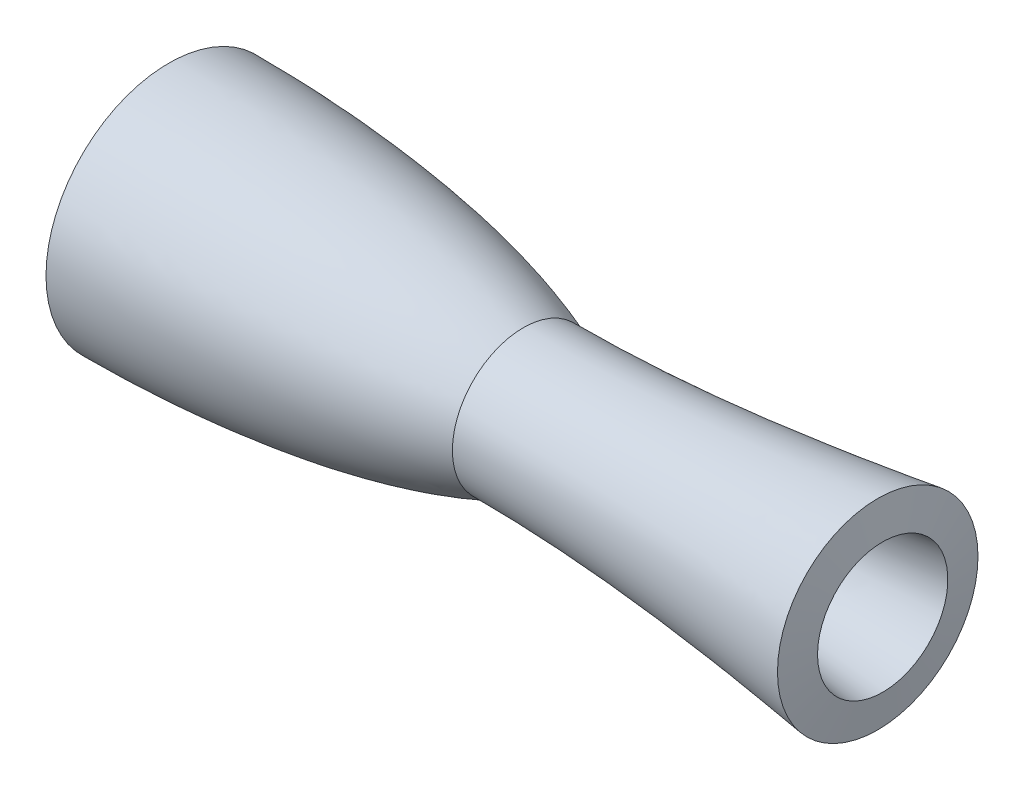
ISO-10303-21;
HEADER;
FILE_DESCRIPTION(('STEP AP214'),'2;1');
FILE_NAME('part.step','',(''),(''),'','','');
FILE_SCHEMA(('AUTOMOTIVE_DESIGN { 1 0 10303 214 1 1 1 1 }'));
ENDSEC;
DATA;
#1=APPLICATION_CONTEXT('core data for automotive mechanical design processes');
#2=APPLICATION_PROTOCOL_DEFINITION('international standard','automotive_design',2000,#1);
#3=PRODUCT_CONTEXT('',#1,'mechanical');
#4=PRODUCT('Part','Part','',(#3));
#5=PRODUCT_RELATED_PRODUCT_CATEGORY('part','',(#4));
#6=PRODUCT_DEFINITION_FORMATION('','',#4);
#7=PRODUCT_DEFINITION_CONTEXT('part definition',#1,'design');
#8=PRODUCT_DEFINITION('design','',#6,#7);
#9=PRODUCT_DEFINITION_SHAPE('','',#8);
#10=(LENGTH_UNIT() NAMED_UNIT(*) SI_UNIT(.MILLI.,.METRE.));
#11=(NAMED_UNIT(*) PLANE_ANGLE_UNIT() SI_UNIT($,.RADIAN.));
#12=(NAMED_UNIT(*) SI_UNIT($,.STERADIAN.) SOLID_ANGLE_UNIT());
#13=UNCERTAINTY_MEASURE_WITH_UNIT(LENGTH_MEASURE(1.E-05),#10,'distance_accuracy_value','');
#14=(GEOMETRIC_REPRESENTATION_CONTEXT(3) GLOBAL_UNCERTAINTY_ASSIGNED_CONTEXT((#13)) GLOBAL_UNIT_ASSIGNED_CONTEXT((#10,
#11,#12)) REPRESENTATION_CONTEXT('',''));
#15=CARTESIAN_POINT('',(0.,0.,0.));
#16=DIRECTION('',(0.,0.,1.));
#17=DIRECTION('',(1.,0.,0.));
#18=AXIS2_PLACEMENT_3D('',#15,#16,#17);
#19=CARTESIAN_POINT('',(98.1549156141227,10.0019360312742,0.));
#20=CARTESIAN_POINT('',(98.687683163248,10.0013754041496,0.));
#21=CARTESIAN_POINT('',(99.2204507119923,10.0008147770255,0.));
#22=CARTESIAN_POINT('',(99.8864101487289,10.0001139931194,0.));
#23=CARTESIAN_POINT('',(100.020260601693,9.99995440538415,0.));
#24=CARTESIAN_POINT('',(100.292445694937,9.99976487695716,0.));
#25=CARTESIAN_POINT('',(100.700708342601,9.9996582834871,0.));
#26=CARTESIAN_POINT('',(102.197505712254,10.0012163933069,0.));
#27=CARTESIAN_POINT('',(105.734073160988,10.0201641607239,0.));
#28=CARTESIAN_POINT('',(113.344241468291,10.1380145877795,0.));
#29=CARTESIAN_POINT('',(119.854324986982,10.3646977299021,0.));
#30=CARTESIAN_POINT('',(132.855166758294,10.9686392967534,0.));
#31=CARTESIAN_POINT('',(141.496612171352,11.5719999766859,0.));
#32=CARTESIAN_POINT('',(167.327696020727,13.8496162288429,0.));
#33=CARTESIAN_POINT('',(184.418775947122,15.9907192937739,0.));
#34=CARTESIAN_POINT('',(201.394709537506,18.38173837419,0.));
#35=B_SPLINE_CURVE_WITH_KNOTS('',3,(#19,#20,#21,#22,#23,#24,#25,#26,#27,#28,#29,#30,#31,#32,#33,
#34),.UNSPECIFIED.,.F.,.F.,(4,2,2,1,1,1,1,2,2,4),(0.,0.0156249999999993,0.0195312499999992,
0.0234374999999991,0.0312499999999993,0.0624999999999991,0.124999999999999,0.249999999999999,
0.499999999999999,1.),.UNSPECIFIED.);
#36=CARTESIAN_POINT('',(0.,0.,0.));
#37=DIRECTION('',(-1.,0.,0.));
#38=AXIS1_PLACEMENT('',#36,#37);
#39=SURFACE_OF_REVOLUTION('',#35,#38);
#40=CARTESIAN_POINT('',(201.394709537506,0.,0.));
#41=DIRECTION('',(-1.,0.,0.));
#42=DIRECTION('',(0.,0.,1.));
#43=AXIS2_PLACEMENT_3D('',#40,#41,#42);
#44=CIRCLE('',#43,18.38173837419);
#45=CARTESIAN_POINT('',(201.394709537506,0.,18.38173837419));
#46=VERTEX_POINT('',#45);
#47=EDGE_CURVE('E12',#46,#46,#44,.T.);
#48=ORIENTED_EDGE('',*,*,#47,.F.);
#49=EDGE_LOOP('',(#48));
#50=FACE_BOUND('',#49,.T.);
#51=CARTESIAN_POINT('',(98.1549156141227,0.,0.));
#52=DIRECTION('',(-1.,0.,0.));
#53=DIRECTION('',(0.,0.,1.));
#54=AXIS2_PLACEMENT_3D('',#51,#52,#53);
#55=CIRCLE('',#54,10.0019360312742);
#56=CARTESIAN_POINT('',(98.1549156141227,0.,10.0019360312742));
#57=VERTEX_POINT('',#56);
#58=EDGE_CURVE('E83',#57,#57,#55,.T.);
#59=ORIENTED_EDGE('',*,*,#58,.T.);
#60=EDGE_LOOP('',(#59));
#61=FACE_BOUND('',#60,.T.);
#62=ADVANCED_FACE('F52',(#50,#61),#39,.T.);
#63=CARTESIAN_POINT('',(200.,0.,0.));
#64=DIRECTION('',(-1.,0.,0.));
#65=DIRECTION('',(0.,0.,1.));
#66=AXIS2_PLACEMENT_3D('',#63,#64,#65);
#67=CONICAL_SURFACE('',#66,28.284,1.43086920031281);
#68=ORIENTED_EDGE('',*,*,#47,.T.);
#69=EDGE_LOOP('',(#68));
#70=FACE_BOUND('',#69,.T.);
#71=CARTESIAN_POINT('',(200.,0.,0.));
#72=DIRECTION('',(-1.,0.,0.));
#73=DIRECTION('',(0.,0.,1.));
#74=AXIS2_PLACEMENT_3D('',#71,#72,#73);
#75=CIRCLE('',#74,28.284);
#76=CARTESIAN_POINT('',(200.,0.,28.284));
#77=VERTEX_POINT('',#76);
#78=EDGE_CURVE('E61',#77,#77,#75,.T.);
#79=ORIENTED_EDGE('',*,*,#78,.F.);
#80=EDGE_LOOP('',(#79));
#81=FACE_BOUND('',#80,.T.);
#82=ADVANCED_FACE('F112',(#70,#81),#67,.T.);
#83=CARTESIAN_POINT('',(100.,20.,0.));
#84=CARTESIAN_POINT('',(116.695242117816,19.9824317273114,0.));
#85=CARTESIAN_POINT('',(150.151112464226,21.7760524174535,0.));
#86=CARTESIAN_POINT('',(183.381389053337,25.9433089474625,0.));
#87=CARTESIAN_POINT('',(200.,28.284,0.));
#88=B_SPLINE_CURVE_WITH_KNOTS('',3,(#83,#84,#85,#86,#87),.UNSPECIFIED.,.F.,.F.,(4,1,4),(0.,
0.498579711466599,1.),.UNSPECIFIED.);
#89=CARTESIAN_POINT('',(0.,0.,0.));
#90=DIRECTION('',(-1.,0.,0.));
#91=AXIS1_PLACEMENT('',#89,#90);
#92=SURFACE_OF_REVOLUTION('',#88,#91);
#93=ORIENTED_EDGE('',*,*,#78,.T.);
#94=EDGE_LOOP('',(#93));
#95=FACE_BOUND('',#94,.T.);
#96=CARTESIAN_POINT('',(100.,0.,0.));
#97=DIRECTION('',(-1.,0.,0.));
#98=DIRECTION('',(0.,0.,1.));
#99=AXIS2_PLACEMENT_3D('',#96,#97,#98);
#100=CIRCLE('',#99,20.);
#101=CARTESIAN_POINT('',(100.,0.,20.));
#102=VERTEX_POINT('',#101);
#103=EDGE_CURVE('E67',#102,#102,#100,.T.);
#104=ORIENTED_EDGE('',*,*,#103,.F.);
#105=EDGE_LOOP('',(#104));
#106=FACE_BOUND('',#105,.T.);
#107=ADVANCED_FACE('F109',(#95,#106),#92,.F.);
#108=CARTESIAN_POINT('',(0.,34.641,0.));
#109=CARTESIAN_POINT('',(16.7095869276814,34.6307944400639,0.));
#110=CARTESIAN_POINT('',(50.5578662107212,32.7566782697457,0.));
#111=CARTESIAN_POINT('',(83.9080542511355,26.129356883055,0.));
#112=CARTESIAN_POINT('',(100.,20.,0.));
#113=B_SPLINE_CURVE_WITH_KNOTS('',3,(#108,#109,#110,#111,#112),.UNSPECIFIED.,.F.,.F.,(4,1,4),
(0.,0.493551598633809,1.),.UNSPECIFIED.);
#114=CARTESIAN_POINT('',(0.,0.,0.));
#115=DIRECTION('',(-1.,0.,0.));
#116=AXIS1_PLACEMENT('',#114,#115);
#117=SURFACE_OF_REVOLUTION('',#113,#116);
#118=ORIENTED_EDGE('',*,*,#103,.T.);
#119=EDGE_LOOP('',(#118));
#120=FACE_BOUND('',#119,.T.);
#121=CARTESIAN_POINT('',(0.,0.,0.));
#122=DIRECTION('',(-1.,0.,0.));
#123=DIRECTION('',(0.,0.,1.));
#124=AXIS2_PLACEMENT_3D('',#121,#122,#123);
#125=CIRCLE('',#124,34.641);
#126=CARTESIAN_POINT('',(0.,0.,34.641));
#127=VERTEX_POINT('',#126);
#128=EDGE_CURVE('E71',#127,#127,#125,.T.);
#129=ORIENTED_EDGE('',*,*,#128,.F.);
#130=EDGE_LOOP('',(#129));
#131=FACE_BOUND('',#130,.T.);
#132=ADVANCED_FACE('F101',(#120,#131),#117,.F.);
#133=CARTESIAN_POINT('',(-0.0061076064158715,0.,0.));
#134=DIRECTION('',(1.,0.,0.));
#135=DIRECTION('',(0.,0.,-1.));
#136=AXIS2_PLACEMENT_3D('',#133,#134,#135);
#137=CONICAL_SURFACE('',#136,24.641001865143,1.57018556611534);
#138=ORIENTED_EDGE('',*,*,#128,.T.);
#139=EDGE_LOOP('',(#138));
#140=FACE_BOUND('',#139,.T.);
#141=CARTESIAN_POINT('',(-0.0061076064158715,0.,0.));
#142=DIRECTION('',(-1.,0.,0.));
#143=DIRECTION('',(0.,0.,1.));
#144=AXIS2_PLACEMENT_3D('',#141,#142,#143);
#145=CIRCLE('',#144,24.641001865143);
#146=CARTESIAN_POINT('',(-0.0061076064158715,0.,24.641001865143));
#147=VERTEX_POINT('',#146);
#148=EDGE_CURVE('E77',#147,#147,#145,.T.);
#149=ORIENTED_EDGE('',*,*,#148,.F.);
#150=EDGE_LOOP('',(#149));
#151=FACE_BOUND('',#150,.T.);
#152=ADVANCED_FACE('F99',(#140,#151),#137,.T.);
#153=CARTESIAN_POINT('',(-0.0061076064158715,24.641001865143,0.));
#154=CARTESIAN_POINT('',(8.42187812270076,24.6358543822117,0.));
#155=CARTESIAN_POINT('',(16.8358985986473,24.3927720559339,0.));
#156=CARTESIAN_POINT('',(29.4119529446047,23.6248175537335,0.));
#157=CARTESIAN_POINT('',(33.5964838088593,23.3016166629081,0.));
#158=CARTESIAN_POINT('',(39.8591442829361,22.7102303806547,0.));
#159=CARTESIAN_POINT('',(41.9443425940642,22.4953377072582,0.));
#160=CARTESIAN_POINT('',(46.1095549841747,22.0290667087082,0.));
#161=CARTESIAN_POINT('',(48.1908855255704,21.7776330899024,0.));
#162=CARTESIAN_POINT('',(58.5665413520777,20.4277007334888,0.));
#163=CARTESIAN_POINT('',(66.7511293827015,19.0464850784838,0.));
#164=CARTESIAN_POINT('',(78.7314668176068,16.2628016448193,0.));
#165=CARTESIAN_POINT('',(82.67562618122,15.2164612130577,0.));
#166=CARTESIAN_POINT('',(88.5050475802807,13.4379146438521,0.));
#167=CARTESIAN_POINT('',(90.433742211419,12.810230615778,0.));
#168=CARTESIAN_POINT('',(93.3037508773156,11.8125219927539,0.));
#169=CARTESIAN_POINT('',(94.4947915800944,11.3851049639654,0.));
#170=CARTESIAN_POINT('',(95.7981663092201,10.8982833885407,0.));
#171=CARTESIAN_POINT('',(96.1826506718351,10.7529600890312,0.));
#172=CARTESIAN_POINT('',(96.3304322404912,10.6968267711091,0.));
#173=CARTESIAN_POINT('',(96.3895370995862,10.6743542442824,0.));
#174=CARTESIAN_POINT('',(96.417604374573,10.663670837638,0.));
#175=CARTESIAN_POINT('',(96.5123668058693,10.6275762118181,0.));
#176=CARTESIAN_POINT('',(97.080941393724,10.4110084568688,0.));
#177=CARTESIAN_POINT('',(97.6495159808025,10.1944407022151,0.));
#178=CARTESIAN_POINT('',(98.1549156141226,10.0019360312742,0.));
#179=B_SPLINE_CURVE_WITH_KNOTS('',3,(#153,#154,#155,#156,#157,#158,#159,#160,#161,#162,#163,
#164,#165,#166,#167,#168,#169,#170,#171,#172,#173,#174,#175,#176,#177,#178),.UNSPECIFIED.,.F.,
.F.,(4,2,2,2,2,2,2,2,1,1,1,2,2,1,4),(0.,0.250000000000001,0.375000000000002,0.437500000000002,
0.500000000000003,0.750000000000005,0.875000000000005,0.937500000000006,0.968750000000006,
0.976562500000006,0.980468750000006,0.981445312500006,0.982421875000006,0.984375000000005,1.),.UNSPECIFIED.);
#180=CARTESIAN_POINT('',(0.,0.,0.));
#181=DIRECTION('',(-1.,0.,0.));
#182=AXIS1_PLACEMENT('',#180,#181);
#183=SURFACE_OF_REVOLUTION('',#179,#182);
#184=ORIENTED_EDGE('',*,*,#58,.F.);
#185=EDGE_LOOP('',(#184));
#186=FACE_BOUND('',#185,.T.);
#187=ORIENTED_EDGE('',*,*,#148,.T.);
#188=EDGE_LOOP('',(#187));
#189=FACE_BOUND('',#188,.T.);
#190=ADVANCED_FACE('F100',(#186,#189),#183,.T.);
#191=CLOSED_SHELL('',(#62,#82,#107,#132,#152,#190));
#192=MANIFOLD_SOLID_BREP('B2',#191);
#193=ADVANCED_BREP_SHAPE_REPRESENTATION('',(#18,#192),#14);
#194=SHAPE_DEFINITION_REPRESENTATION(#9,#193);
ENDSEC;
END-ISO-10303-21;
